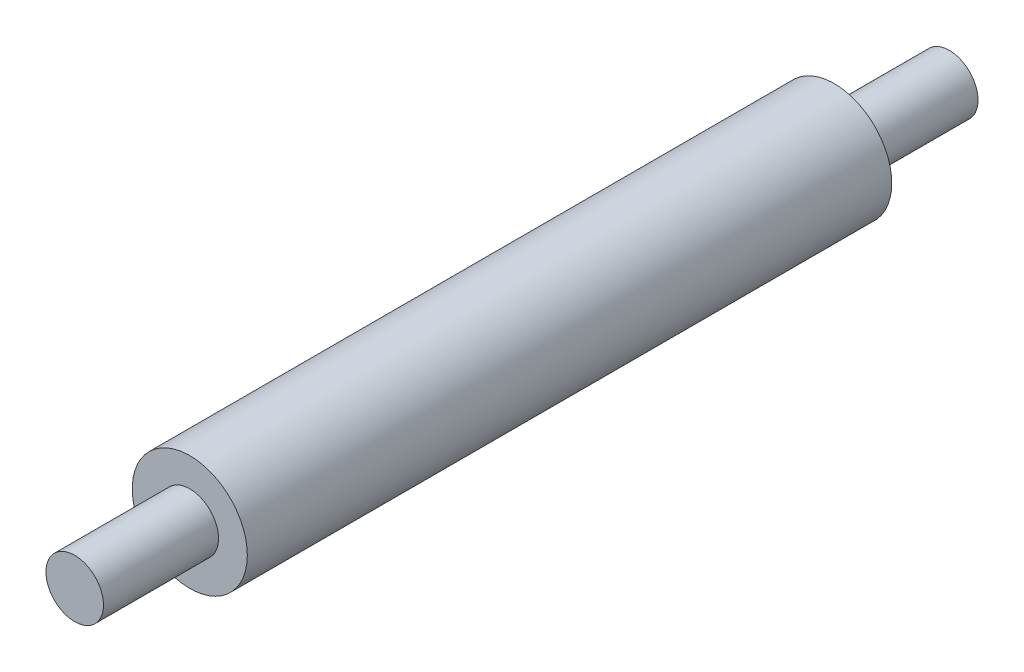
ISO-10303-21;
HEADER;
FILE_DESCRIPTION(('STEP AP214'),'2;1');
FILE_NAME('part.step','',(''),(''),'','','');
FILE_SCHEMA(('AUTOMOTIVE_DESIGN { 1 0 10303 214 1 1 1 1 }'));
ENDSEC;
DATA;
#1=APPLICATION_CONTEXT('core data for automotive mechanical design processes');
#2=APPLICATION_PROTOCOL_DEFINITION('international standard','automotive_design',2000,#1);
#3=PRODUCT_CONTEXT('',#1,'mechanical');
#4=PRODUCT('Part','Part','',(#3));
#5=PRODUCT_RELATED_PRODUCT_CATEGORY('part','',(#4));
#6=PRODUCT_DEFINITION_FORMATION('','',#4);
#7=PRODUCT_DEFINITION_CONTEXT('part definition',#1,'design');
#8=PRODUCT_DEFINITION('design','',#6,#7);
#9=PRODUCT_DEFINITION_SHAPE('','',#8);
#10=(LENGTH_UNIT() NAMED_UNIT(*) SI_UNIT(.MILLI.,.METRE.));
#11=(NAMED_UNIT(*) PLANE_ANGLE_UNIT() SI_UNIT($,.RADIAN.));
#12=(NAMED_UNIT(*) SI_UNIT($,.STERADIAN.) SOLID_ANGLE_UNIT());
#13=UNCERTAINTY_MEASURE_WITH_UNIT(LENGTH_MEASURE(1.E-05),#10,'distance_accuracy_value','');
#14=(GEOMETRIC_REPRESENTATION_CONTEXT(3) GLOBAL_UNCERTAINTY_ASSIGNED_CONTEXT((#13)) GLOBAL_UNIT_ASSIGNED_CONTEXT((#10,
#11,#12)) REPRESENTATION_CONTEXT('',''));
#15=CARTESIAN_POINT('',(0.,0.,0.));
#16=DIRECTION('',(0.,0.,1.));
#17=DIRECTION('',(1.,0.,0.));
#18=AXIS2_PLACEMENT_3D('',#15,#16,#17);
#19=CARTESIAN_POINT('',(0.,0.,28.));
#20=DIRECTION('',(0.,0.,-1.));
#21=DIRECTION('',(-1.,0.,0.));
#22=AXIS2_PLACEMENT_3D('',#19,#20,#21);
#23=CYLINDRICAL_SURFACE('',#22,2.5);
#24=CARTESIAN_POINT('',(0.,0.,28.));
#25=DIRECTION('',(0.,0.,1.));
#26=DIRECTION('',(1.,0.,0.));
#27=AXIS2_PLACEMENT_3D('',#24,#25,#26);
#28=CIRCLE('',#27,2.5);
#29=CARTESIAN_POINT('',(2.5,0.,28.));
#30=VERTEX_POINT('',#29);
#31=EDGE_CURVE('E43',#30,#30,#28,.T.);
#32=ORIENTED_EDGE('',*,*,#31,.F.);
#33=EDGE_LOOP('',(#32));
#34=FACE_BOUND('',#33,.T.);
#35=CARTESIAN_POINT('',(0.,0.,0.));
#36=DIRECTION('',(0.,0.,1.));
#37=DIRECTION('',(1.,0.,0.));
#38=AXIS2_PLACEMENT_3D('',#35,#36,#37);
#39=CIRCLE('',#38,2.5);
#40=CARTESIAN_POINT('',(2.5,0.,0.));
#41=VERTEX_POINT('',#40);
#42=EDGE_CURVE('E34',#41,#41,#39,.T.);
#43=ORIENTED_EDGE('',*,*,#42,.T.);
#44=EDGE_LOOP('',(#43));
#45=FACE_BOUND('',#44,.T.);
#46=ADVANCED_FACE('F31',(#34,#45),#23,.T.);
#47=CARTESIAN_POINT('',(0.,0.,28.));
#48=DIRECTION('',(0.,0.,1.));
#49=DIRECTION('',(1.,0.,0.));
#50=AXIS2_PLACEMENT_3D('',#47,#48,#49);
#51=PLANE('',#50);
#52=CARTESIAN_POINT('',(0.,0.,28.));
#53=DIRECTION('',(0.,0.,1.));
#54=DIRECTION('',(1.,0.,0.));
#55=AXIS2_PLACEMENT_3D('',#52,#53,#54);
#56=CIRCLE('',#55,1.25);
#57=CARTESIAN_POINT('',(1.25,0.,28.));
#58=VERTEX_POINT('',#57);
#59=EDGE_CURVE('E38',#58,#58,#56,.T.);
#60=ORIENTED_EDGE('',*,*,#59,.F.);
#61=EDGE_LOOP('',(#60));
#62=FACE_BOUND('',#61,.T.);
#63=ORIENTED_EDGE('',*,*,#31,.T.);
#64=EDGE_LOOP('',(#63));
#65=FACE_BOUND('',#64,.T.);
#66=ADVANCED_FACE('F60',(#62,#65),#51,.T.);
#67=CARTESIAN_POINT('',(0.,0.,0.));
#68=DIRECTION('',(0.,0.,1.));
#69=DIRECTION('',(1.,0.,0.));
#70=AXIS2_PLACEMENT_3D('',#67,#68,#69);
#71=PLANE('',#70);
#72=CARTESIAN_POINT('',(0.,0.,0.));
#73=DIRECTION('',(0.,0.,-1.));
#74=DIRECTION('',(-1.,0.,0.));
#75=AXIS2_PLACEMENT_3D('',#72,#73,#74);
#76=CIRCLE('',#75,1.25);
#77=CARTESIAN_POINT('',(-1.25,0.,0.));
#78=VERTEX_POINT('',#77);
#79=EDGE_CURVE('E10',#78,#78,#76,.T.);
#80=ORIENTED_EDGE('',*,*,#79,.F.);
#81=EDGE_LOOP('',(#80));
#82=FACE_BOUND('',#81,.T.);
#83=ORIENTED_EDGE('',*,*,#42,.F.);
#84=EDGE_LOOP('',(#83));
#85=FACE_BOUND('',#84,.T.);
#86=ADVANCED_FACE('F57',(#82,#85),#71,.F.);
#87=CARTESIAN_POINT('',(0.,0.,33.));
#88=DIRECTION('',(0.,0.,-1.));
#89=DIRECTION('',(-1.,0.,0.));
#90=AXIS2_PLACEMENT_3D('',#87,#88,#89);
#91=CYLINDRICAL_SURFACE('',#90,1.25);
#92=CARTESIAN_POINT('',(0.,0.,33.));
#93=DIRECTION('',(0.,0.,1.));
#94=DIRECTION('',(1.,0.,0.));
#95=AXIS2_PLACEMENT_3D('',#92,#93,#94);
#96=CIRCLE('',#95,1.25);
#97=CARTESIAN_POINT('',(1.25,0.,33.));
#98=VERTEX_POINT('',#97);
#99=EDGE_CURVE('E48',#98,#98,#96,.T.);
#100=ORIENTED_EDGE('',*,*,#99,.F.);
#101=EDGE_LOOP('',(#100));
#102=FACE_BOUND('',#101,.T.);
#103=ORIENTED_EDGE('',*,*,#59,.T.);
#104=EDGE_LOOP('',(#103));
#105=FACE_BOUND('',#104,.T.);
#106=ADVANCED_FACE('F59',(#102,#105),#91,.T.);
#107=CARTESIAN_POINT('',(0.,0.,33.));
#108=DIRECTION('',(0.,0.,1.));
#109=DIRECTION('',(1.,0.,0.));
#110=AXIS2_PLACEMENT_3D('',#107,#108,#109);
#111=PLANE('',#110);
#112=ORIENTED_EDGE('',*,*,#99,.T.);
#113=EDGE_LOOP('',(#112));
#114=FACE_BOUND('',#113,.T.);
#115=ADVANCED_FACE('F66',(#114),#111,.T.);
#116=CARTESIAN_POINT('',(0.,0.,-5.));
#117=DIRECTION('',(0.,0.,1.));
#118=DIRECTION('',(1.,0.,0.));
#119=AXIS2_PLACEMENT_3D('',#116,#117,#118);
#120=CYLINDRICAL_SURFACE('',#119,1.25);
#121=CARTESIAN_POINT('',(0.,0.,-5.));
#122=DIRECTION('',(0.,0.,-1.));
#123=DIRECTION('',(-1.,0.,0.));
#124=AXIS2_PLACEMENT_3D('',#121,#122,#123);
#125=CIRCLE('',#124,1.25);
#126=CARTESIAN_POINT('',(-1.25,0.,-5.));
#127=VERTEX_POINT('',#126);
#128=EDGE_CURVE('E47',#127,#127,#125,.T.);
#129=ORIENTED_EDGE('',*,*,#128,.F.);
#130=EDGE_LOOP('',(#129));
#131=FACE_BOUND('',#130,.T.);
#132=ORIENTED_EDGE('',*,*,#79,.T.);
#133=EDGE_LOOP('',(#132));
#134=FACE_BOUND('',#133,.T.);
#135=ADVANCED_FACE('F94',(#131,#134),#120,.T.);
#136=CARTESIAN_POINT('',(0.,0.,-5.));
#137=DIRECTION('',(0.,0.,-1.));
#138=DIRECTION('',(-1.,0.,0.));
#139=AXIS2_PLACEMENT_3D('',#136,#137,#138);
#140=PLANE('',#139);
#141=ORIENTED_EDGE('',*,*,#128,.T.);
#142=EDGE_LOOP('',(#141));
#143=FACE_BOUND('',#142,.T.);
#144=ADVANCED_FACE('F108',(#143),#140,.T.);
#145=CLOSED_SHELL('',(#46,#66,#86,#106,#115,#135,#144));
#146=MANIFOLD_SOLID_BREP('B2',#145);
#147=ADVANCED_BREP_SHAPE_REPRESENTATION('',(#18,#146),#14);
#148=SHAPE_DEFINITION_REPRESENTATION(#9,#147);
ENDSEC;
END-ISO-10303-21;
